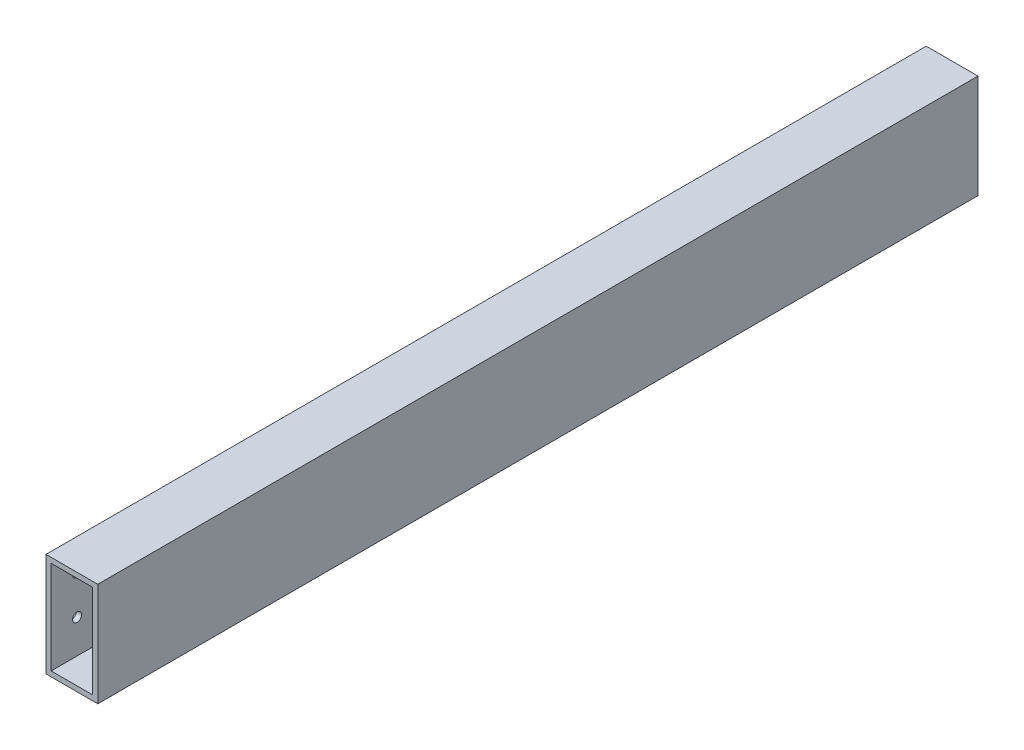
ISO-10303-21;
HEADER;
FILE_DESCRIPTION(('STEP AP214'),'2;1');
FILE_NAME('part.step','',(''),(''),'','','');
FILE_SCHEMA(('AUTOMOTIVE_DESIGN { 1 0 10303 214 1 1 1 1 }'));
ENDSEC;
DATA;
#1=APPLICATION_CONTEXT('core data for automotive mechanical design processes');
#2=APPLICATION_PROTOCOL_DEFINITION('international standard','automotive_design',2000,#1);
#3=PRODUCT_CONTEXT('',#1,'mechanical');
#4=PRODUCT('Part','Part','',(#3));
#5=PRODUCT_RELATED_PRODUCT_CATEGORY('part','',(#4));
#6=PRODUCT_DEFINITION_FORMATION('','',#4);
#7=PRODUCT_DEFINITION_CONTEXT('part definition',#1,'design');
#8=PRODUCT_DEFINITION('design','',#6,#7);
#9=PRODUCT_DEFINITION_SHAPE('','',#8);
#10=(LENGTH_UNIT() NAMED_UNIT(*) SI_UNIT(.MILLI.,.METRE.));
#11=(NAMED_UNIT(*) PLANE_ANGLE_UNIT() SI_UNIT($,.RADIAN.));
#12=(NAMED_UNIT(*) SI_UNIT($,.STERADIAN.) SOLID_ANGLE_UNIT());
#13=UNCERTAINTY_MEASURE_WITH_UNIT(LENGTH_MEASURE(1.E-05),#10,'distance_accuracy_value','');
#14=(GEOMETRIC_REPRESENTATION_CONTEXT(3) GLOBAL_UNCERTAINTY_ASSIGNED_CONTEXT((#13)) GLOBAL_UNIT_ASSIGNED_CONTEXT((#10,
#11,#12)) REPRESENTATION_CONTEXT('',''));
#15=CARTESIAN_POINT('',(0.,0.,0.));
#16=DIRECTION('',(0.,0.,1.));
#17=DIRECTION('',(1.,0.,0.));
#18=AXIS2_PLACEMENT_3D('',#15,#16,#17);
#19=CARTESIAN_POINT('',(0.,0.,340.));
#20=DIRECTION('',(0.,0.,-1.));
#21=DIRECTION('',(-1.,0.,0.));
#22=AXIS2_PLACEMENT_3D('',#19,#20,#21);
#23=PLANE('',#22);
#24=DIRECTION('',(0.,-1.,0.));
#25=VECTOR('',#24,1.);
#26=CARTESIAN_POINT('',(0.,0.,340.));
#27=LINE('',#26,#25);
#28=CARTESIAN_POINT('',(0.,40.,340.));
#29=VERTEX_POINT('',#28);
#30=CARTESIAN_POINT('',(0.,0.,340.));
#31=VERTEX_POINT('',#30);
#32=EDGE_CURVE('E136',#29,#31,#27,.T.);
#33=ORIENTED_EDGE('',*,*,#32,.T.);
#34=DIRECTION('',(1.,0.,0.));
#35=VECTOR('',#34,1.);
#36=CARTESIAN_POINT('',(0.,0.,340.));
#37=LINE('',#36,#35);
#38=CARTESIAN_POINT('',(20.,0.,340.));
#39=VERTEX_POINT('',#38);
#40=EDGE_CURVE('E139',#31,#39,#37,.T.);
#41=ORIENTED_EDGE('',*,*,#40,.T.);
#42=DIRECTION('',(0.,1.,0.));
#43=VECTOR('',#42,1.);
#44=CARTESIAN_POINT('',(20.,0.,340.));
#45=LINE('',#44,#43);
#46=CARTESIAN_POINT('',(20.,40.,340.));
#47=VERTEX_POINT('',#46);
#48=EDGE_CURVE('E142',#39,#47,#45,.T.);
#49=ORIENTED_EDGE('',*,*,#48,.T.);
#50=DIRECTION('',(-1.,0.,0.));
#51=VECTOR('',#50,1.);
#52=CARTESIAN_POINT('',(0.,40.,340.));
#53=LINE('',#52,#51);
#54=EDGE_CURVE('E144',#47,#29,#53,.T.);
#55=ORIENTED_EDGE('',*,*,#54,.T.);
#56=EDGE_LOOP('',(#33,#41,#49,#55));
#57=FACE_BOUND('',#56,.T.);
#58=DIRECTION('',(0.,-1.,0.));
#59=VECTOR('',#58,1.);
#60=CARTESIAN_POINT('',(2.,2.,340.));
#61=LINE('',#60,#59);
#62=CARTESIAN_POINT('',(2.,38.,340.));
#63=VERTEX_POINT('',#62);
#64=CARTESIAN_POINT('',(2.,2.,340.));
#65=VERTEX_POINT('',#64);
#66=EDGE_CURVE('E98',#63,#65,#61,.T.);
#67=ORIENTED_EDGE('',*,*,#66,.F.);
#68=DIRECTION('',(-1.,0.,0.));
#69=VECTOR('',#68,1.);
#70=CARTESIAN_POINT('',(2.,38.,340.));
#71=LINE('',#70,#69);
#72=CARTESIAN_POINT('',(18.,38.,340.));
#73=VERTEX_POINT('',#72);
#74=EDGE_CURVE('E120',#73,#63,#71,.T.);
#75=ORIENTED_EDGE('',*,*,#74,.F.);
#76=DIRECTION('',(0.,1.,0.));
#77=VECTOR('',#76,1.);
#78=CARTESIAN_POINT('',(18.,2.,340.));
#79=LINE('',#78,#77);
#80=CARTESIAN_POINT('',(18.,2.,340.));
#81=VERTEX_POINT('',#80);
#82=EDGE_CURVE('E118',#81,#73,#79,.T.);
#83=ORIENTED_EDGE('',*,*,#82,.F.);
#84=DIRECTION('',(1.,0.,0.));
#85=VECTOR('',#84,1.);
#86=CARTESIAN_POINT('',(2.,2.,340.));
#87=LINE('',#86,#85);
#88=EDGE_CURVE('E106',#65,#81,#87,.T.);
#89=ORIENTED_EDGE('',*,*,#88,.F.);
#90=EDGE_LOOP('',(#67,#75,#83,#89));
#91=FACE_BOUND('',#90,.T.);
#92=ADVANCED_FACE('F33',(#57,#91),#23,.F.);
#93=CARTESIAN_POINT('',(0.,0.,0.));
#94=DIRECTION('',(0.,0.,-1.));
#95=DIRECTION('',(-1.,0.,0.));
#96=AXIS2_PLACEMENT_3D('',#93,#94,#95);
#97=PLANE('',#96);
#98=DIRECTION('',(0.,-1.,0.));
#99=VECTOR('',#98,1.);
#100=CARTESIAN_POINT('',(0.,0.,0.));
#101=LINE('',#100,#99);
#102=CARTESIAN_POINT('',(0.,40.,0.));
#103=VERTEX_POINT('',#102);
#104=CARTESIAN_POINT('',(0.,0.,0.));
#105=VERTEX_POINT('',#104);
#106=EDGE_CURVE('E114',#103,#105,#101,.T.);
#107=ORIENTED_EDGE('',*,*,#106,.F.);
#108=DIRECTION('',(-1.,0.,0.));
#109=VECTOR('',#108,1.);
#110=CARTESIAN_POINT('',(0.,40.,0.));
#111=LINE('',#110,#109);
#112=CARTESIAN_POINT('',(20.,40.,0.));
#113=VERTEX_POINT('',#112);
#114=EDGE_CURVE('E140',#113,#103,#111,.T.);
#115=ORIENTED_EDGE('',*,*,#114,.F.);
#116=DIRECTION('',(0.,1.,0.));
#117=VECTOR('',#116,1.);
#118=CARTESIAN_POINT('',(20.,0.,0.));
#119=LINE('',#118,#117);
#120=CARTESIAN_POINT('',(20.,0.,0.));
#121=VERTEX_POINT('',#120);
#122=EDGE_CURVE('E151',#121,#113,#119,.T.);
#123=ORIENTED_EDGE('',*,*,#122,.F.);
#124=DIRECTION('',(1.,0.,0.));
#125=VECTOR('',#124,1.);
#126=CARTESIAN_POINT('',(0.,0.,0.));
#127=LINE('',#126,#125);
#128=EDGE_CURVE('E149',#105,#121,#127,.T.);
#129=ORIENTED_EDGE('',*,*,#128,.F.);
#130=EDGE_LOOP('',(#107,#115,#123,#129));
#131=FACE_BOUND('',#130,.T.);
#132=DIRECTION('',(-1.,0.,0.));
#133=VECTOR('',#132,1.);
#134=CARTESIAN_POINT('',(2.,38.,0.));
#135=LINE('',#134,#133);
#136=CARTESIAN_POINT('',(18.,38.,0.));
#137=VERTEX_POINT('',#136);
#138=CARTESIAN_POINT('',(2.,38.,0.));
#139=VERTEX_POINT('',#138);
#140=EDGE_CURVE('E107',#137,#139,#135,.T.);
#141=ORIENTED_EDGE('',*,*,#140,.T.);
#142=DIRECTION('',(0.,-1.,0.));
#143=VECTOR('',#142,1.);
#144=CARTESIAN_POINT('',(2.,2.,0.));
#145=LINE('',#144,#143);
#146=CARTESIAN_POINT('',(2.,2.,0.));
#147=VERTEX_POINT('',#146);
#148=EDGE_CURVE('E56',#139,#147,#145,.T.);
#149=ORIENTED_EDGE('',*,*,#148,.T.);
#150=DIRECTION('',(1.,0.,0.));
#151=VECTOR('',#150,1.);
#152=CARTESIAN_POINT('',(2.,2.,0.));
#153=LINE('',#152,#151);
#154=CARTESIAN_POINT('',(18.,2.,0.));
#155=VERTEX_POINT('',#154);
#156=EDGE_CURVE('E113',#147,#155,#153,.T.);
#157=ORIENTED_EDGE('',*,*,#156,.T.);
#158=DIRECTION('',(0.,1.,0.));
#159=VECTOR('',#158,1.);
#160=CARTESIAN_POINT('',(18.,2.,0.));
#161=LINE('',#160,#159);
#162=EDGE_CURVE('E128',#155,#137,#161,.T.);
#163=ORIENTED_EDGE('',*,*,#162,.T.);
#164=EDGE_LOOP('',(#141,#149,#157,#163));
#165=FACE_BOUND('',#164,.T.);
#166=ADVANCED_FACE('F169',(#131,#165),#97,.T.);
#167=CARTESIAN_POINT('',(0.,0.,340.));
#168=DIRECTION('',(1.,0.,0.));
#169=DIRECTION('',(0.,0.,-1.));
#170=AXIS2_PLACEMENT_3D('',#167,#168,#169);
#171=PLANE('',#170);
#172=CARTESIAN_POINT('',(0.,30.,330.));
#173=DIRECTION('',(-1.,0.,0.));
#174=DIRECTION('',(0.,0.,-1.));
#175=AXIS2_PLACEMENT_3D('',#172,#173,#174);
#176=CIRCLE('',#175,1.74999999999998);
#177=CARTESIAN_POINT('',(0.,30.,328.25));
#178=VERTEX_POINT('',#177);
#179=EDGE_CURVE('E240',#178,#178,#176,.T.);
#180=ORIENTED_EDGE('',*,*,#179,.F.);
#181=EDGE_LOOP('',(#180));
#182=FACE_BOUND('',#181,.T.);
#183=CARTESIAN_POINT('',(0.,15.,330.));
#184=DIRECTION('',(-1.,0.,0.));
#185=DIRECTION('',(0.,0.,-1.));
#186=AXIS2_PLACEMENT_3D('',#183,#184,#185);
#187=CIRCLE('',#186,1.74999999999998);
#188=CARTESIAN_POINT('',(0.,15.,328.25));
#189=VERTEX_POINT('',#188);
#190=EDGE_CURVE('E244',#189,#189,#187,.T.);
#191=ORIENTED_EDGE('',*,*,#190,.F.);
#192=EDGE_LOOP('',(#191));
#193=FACE_BOUND('',#192,.T.);
#194=CARTESIAN_POINT('',(0.,15.,285.));
#195=DIRECTION('',(-1.,0.,0.));
#196=DIRECTION('',(0.,0.,-1.));
#197=AXIS2_PLACEMENT_3D('',#194,#195,#196);
#198=CIRCLE('',#197,1.74999999999998);
#199=CARTESIAN_POINT('',(0.,15.,283.25));
#200=VERTEX_POINT('',#199);
#201=EDGE_CURVE('E248',#200,#200,#198,.T.);
#202=ORIENTED_EDGE('',*,*,#201,.F.);
#203=EDGE_LOOP('',(#202));
#204=FACE_BOUND('',#203,.T.);
#205=CARTESIAN_POINT('',(0.,15.,10.));
#206=DIRECTION('',(-1.,0.,0.));
#207=DIRECTION('',(0.,0.,1.));
#208=AXIS2_PLACEMENT_3D('',#205,#206,#207);
#209=CIRCLE('',#208,1.75);
#210=CARTESIAN_POINT('',(0.,15.,11.75));
#211=VERTEX_POINT('',#210);
#212=EDGE_CURVE('E257',#211,#211,#209,.T.);
#213=ORIENTED_EDGE('',*,*,#212,.F.);
#214=EDGE_LOOP('',(#213));
#215=FACE_BOUND('',#214,.T.);
#216=CARTESIAN_POINT('',(0.,15.,70.));
#217=DIRECTION('',(-1.,0.,0.));
#218=DIRECTION('',(0.,0.,1.));
#219=AXIS2_PLACEMENT_3D('',#216,#217,#218);
#220=CIRCLE('',#219,1.75);
#221=CARTESIAN_POINT('',(0.,15.,71.75));
#222=VERTEX_POINT('',#221);
#223=EDGE_CURVE('E253',#222,#222,#220,.T.);
#224=ORIENTED_EDGE('',*,*,#223,.F.);
#225=EDGE_LOOP('',(#224));
#226=FACE_BOUND('',#225,.T.);
#227=CARTESIAN_POINT('',(0.,15.,55.));
#228=DIRECTION('',(-1.,0.,0.));
#229=DIRECTION('',(0.,0.,1.));
#230=AXIS2_PLACEMENT_3D('',#227,#228,#229);
#231=CIRCLE('',#230,1.75);
#232=CARTESIAN_POINT('',(0.,15.,56.75));
#233=VERTEX_POINT('',#232);
#234=EDGE_CURVE('E264',#233,#233,#231,.T.);
#235=ORIENTED_EDGE('',*,*,#234,.F.);
#236=EDGE_LOOP('',(#235));
#237=FACE_BOUND('',#236,.T.);
#238=CARTESIAN_POINT('',(0.,15.,270.));
#239=DIRECTION('',(-1.,0.,0.));
#240=DIRECTION('',(0.,0.,-1.));
#241=AXIS2_PLACEMENT_3D('',#238,#239,#240);
#242=CIRCLE('',#241,1.74999999999998);
#243=CARTESIAN_POINT('',(0.,15.,268.25));
#244=VERTEX_POINT('',#243);
#245=EDGE_CURVE('E252',#244,#244,#242,.T.);
#246=ORIENTED_EDGE('',*,*,#245,.F.);
#247=EDGE_LOOP('',(#246));
#248=FACE_BOUND('',#247,.T.);
#249=CARTESIAN_POINT('',(0.,30.,10.));
#250=DIRECTION('',(-1.,0.,0.));
#251=DIRECTION('',(0.,0.,1.));
#252=AXIS2_PLACEMENT_3D('',#249,#250,#251);
#253=CIRCLE('',#252,1.75);
#254=CARTESIAN_POINT('',(0.,30.,11.75));
#255=VERTEX_POINT('',#254);
#256=EDGE_CURVE('E236',#255,#255,#253,.T.);
#257=ORIENTED_EDGE('',*,*,#256,.F.);
#258=EDGE_LOOP('',(#257));
#259=FACE_BOUND('',#258,.T.);
#260=ORIENTED_EDGE('',*,*,#106,.T.);
#261=DIRECTION('',(0.,0.,-1.));
#262=VECTOR('',#261,1.);
#263=CARTESIAN_POINT('',(0.,0.,340.));
#264=LINE('',#263,#262);
#265=EDGE_CURVE('E11',#31,#105,#264,.T.);
#266=ORIENTED_EDGE('',*,*,#265,.F.);
#267=ORIENTED_EDGE('',*,*,#32,.F.);
#268=DIRECTION('',(0.,0.,-1.));
#269=VECTOR('',#268,1.);
#270=CARTESIAN_POINT('',(0.,40.,340.));
#271=LINE('',#270,#269);
#272=EDGE_CURVE('E146',#29,#103,#271,.T.);
#273=ORIENTED_EDGE('',*,*,#272,.T.);
#274=EDGE_LOOP('',(#260,#266,#267,#273));
#275=FACE_BOUND('',#274,.T.);
#276=ADVANCED_FACE('F35',(#182,#193,#204,#215,#226,#237,#248,#259,#275),#171,.F.);
#277=CARTESIAN_POINT('',(0.,0.,340.));
#278=DIRECTION('',(0.,1.,0.));
#279=DIRECTION('',(0.,0.,1.));
#280=AXIS2_PLACEMENT_3D('',#277,#278,#279);
#281=PLANE('',#280);
#282=ORIENTED_EDGE('',*,*,#128,.T.);
#283=DIRECTION('',(0.,0.,-1.));
#284=VECTOR('',#283,1.);
#285=CARTESIAN_POINT('',(20.,0.,340.));
#286=LINE('',#285,#284);
#287=EDGE_CURVE('E41',#39,#121,#286,.T.);
#288=ORIENTED_EDGE('',*,*,#287,.F.);
#289=ORIENTED_EDGE('',*,*,#40,.F.);
#290=ORIENTED_EDGE('',*,*,#265,.T.);
#291=EDGE_LOOP('',(#282,#288,#289,#290));
#292=FACE_BOUND('',#291,.T.);
#293=ADVANCED_FACE('F179',(#292),#281,.F.);
#294=CARTESIAN_POINT('',(20.,0.,340.));
#295=DIRECTION('',(-1.,0.,0.));
#296=DIRECTION('',(0.,0.,1.));
#297=AXIS2_PLACEMENT_3D('',#294,#295,#296);
#298=PLANE('',#297);
#299=ORIENTED_EDGE('',*,*,#122,.T.);
#300=DIRECTION('',(0.,0.,-1.));
#301=VECTOR('',#300,1.);
#302=CARTESIAN_POINT('',(20.,40.,340.));
#303=LINE('',#302,#301);
#304=EDGE_CURVE('E156',#47,#113,#303,.T.);
#305=ORIENTED_EDGE('',*,*,#304,.F.);
#306=ORIENTED_EDGE('',*,*,#48,.F.);
#307=ORIENTED_EDGE('',*,*,#287,.T.);
#308=EDGE_LOOP('',(#299,#305,#306,#307));
#309=FACE_BOUND('',#308,.T.);
#310=ADVANCED_FACE('F163',(#309),#298,.F.);
#311=CARTESIAN_POINT('',(0.,40.,340.));
#312=DIRECTION('',(0.,-1.,0.));
#313=DIRECTION('',(0.,0.,-1.));
#314=AXIS2_PLACEMENT_3D('',#311,#312,#313);
#315=PLANE('',#314);
#316=ORIENTED_EDGE('',*,*,#114,.T.);
#317=ORIENTED_EDGE('',*,*,#272,.F.);
#318=ORIENTED_EDGE('',*,*,#54,.F.);
#319=ORIENTED_EDGE('',*,*,#304,.T.);
#320=EDGE_LOOP('',(#316,#317,#318,#319));
#321=FACE_BOUND('',#320,.T.);
#322=ADVANCED_FACE('F173',(#321),#315,.F.);
#323=CARTESIAN_POINT('',(2.,2.,340.));
#324=DIRECTION('',(1.,0.,0.));
#325=DIRECTION('',(0.,0.,-1.));
#326=AXIS2_PLACEMENT_3D('',#323,#324,#325);
#327=PLANE('',#326);
#328=CARTESIAN_POINT('',(2.,30.,330.));
#329=DIRECTION('',(-1.,0.,0.));
#330=DIRECTION('',(0.,0.,-1.));
#331=AXIS2_PLACEMENT_3D('',#328,#329,#330);
#332=CIRCLE('',#331,1.74999999999998);
#333=CARTESIAN_POINT('',(2.,30.,328.25));
#334=VERTEX_POINT('',#333);
#335=EDGE_CURVE('E208',#334,#334,#332,.T.);
#336=ORIENTED_EDGE('',*,*,#335,.T.);
#337=EDGE_LOOP('',(#336));
#338=FACE_BOUND('',#337,.T.);
#339=CARTESIAN_POINT('',(2.,15.,330.));
#340=DIRECTION('',(-1.,0.,0.));
#341=DIRECTION('',(0.,0.,-1.));
#342=AXIS2_PLACEMENT_3D('',#339,#340,#341);
#343=CIRCLE('',#342,1.74999999999998);
#344=CARTESIAN_POINT('',(2.,15.,328.25));
#345=VERTEX_POINT('',#344);
#346=EDGE_CURVE('E212',#345,#345,#343,.T.);
#347=ORIENTED_EDGE('',*,*,#346,.T.);
#348=EDGE_LOOP('',(#347));
#349=FACE_BOUND('',#348,.T.);
#350=CARTESIAN_POINT('',(2.,15.,285.));
#351=DIRECTION('',(-1.,0.,0.));
#352=DIRECTION('',(0.,0.,-1.));
#353=AXIS2_PLACEMENT_3D('',#350,#351,#352);
#354=CIRCLE('',#353,1.74999999999998);
#355=CARTESIAN_POINT('',(2.,15.,283.25));
#356=VERTEX_POINT('',#355);
#357=EDGE_CURVE('E216',#356,#356,#354,.T.);
#358=ORIENTED_EDGE('',*,*,#357,.T.);
#359=EDGE_LOOP('',(#358));
#360=FACE_BOUND('',#359,.T.);
#361=CARTESIAN_POINT('',(2.,15.,10.));
#362=DIRECTION('',(-1.,0.,0.));
#363=DIRECTION('',(0.,0.,1.));
#364=AXIS2_PLACEMENT_3D('',#361,#362,#363);
#365=CIRCLE('',#364,1.75);
#366=CARTESIAN_POINT('',(2.,15.,11.75));
#367=VERTEX_POINT('',#366);
#368=EDGE_CURVE('E220',#367,#367,#365,.T.);
#369=ORIENTED_EDGE('',*,*,#368,.T.);
#370=EDGE_LOOP('',(#369));
#371=FACE_BOUND('',#370,.T.);
#372=CARTESIAN_POINT('',(2.,15.,70.));
#373=DIRECTION('',(-1.,0.,0.));
#374=DIRECTION('',(0.,0.,1.));
#375=AXIS2_PLACEMENT_3D('',#372,#373,#374);
#376=CIRCLE('',#375,1.75);
#377=CARTESIAN_POINT('',(2.,15.,71.75));
#378=VERTEX_POINT('',#377);
#379=EDGE_CURVE('E224',#378,#378,#376,.T.);
#380=ORIENTED_EDGE('',*,*,#379,.T.);
#381=EDGE_LOOP('',(#380));
#382=FACE_BOUND('',#381,.T.);
#383=CARTESIAN_POINT('',(2.,15.,55.));
#384=DIRECTION('',(-1.,0.,0.));
#385=DIRECTION('',(0.,0.,1.));
#386=AXIS2_PLACEMENT_3D('',#383,#384,#385);
#387=CIRCLE('',#386,1.75);
#388=CARTESIAN_POINT('',(2.,15.,56.75));
#389=VERTEX_POINT('',#388);
#390=EDGE_CURVE('E228',#389,#389,#387,.T.);
#391=ORIENTED_EDGE('',*,*,#390,.T.);
#392=EDGE_LOOP('',(#391));
#393=FACE_BOUND('',#392,.T.);
#394=CARTESIAN_POINT('',(2.,15.,270.));
#395=DIRECTION('',(-1.,0.,0.));
#396=DIRECTION('',(0.,0.,-1.));
#397=AXIS2_PLACEMENT_3D('',#394,#395,#396);
#398=CIRCLE('',#397,1.74999999999998);
#399=CARTESIAN_POINT('',(2.,15.,268.25));
#400=VERTEX_POINT('',#399);
#401=EDGE_CURVE('E232',#400,#400,#398,.T.);
#402=ORIENTED_EDGE('',*,*,#401,.T.);
#403=EDGE_LOOP('',(#402));
#404=FACE_BOUND('',#403,.T.);
#405=CARTESIAN_POINT('',(2.,30.,10.));
#406=DIRECTION('',(-1.,0.,0.));
#407=DIRECTION('',(0.,0.,1.));
#408=AXIS2_PLACEMENT_3D('',#405,#406,#407);
#409=CIRCLE('',#408,1.75);
#410=CARTESIAN_POINT('',(2.,30.,11.75));
#411=VERTEX_POINT('',#410);
#412=EDGE_CURVE('E126',#411,#411,#409,.T.);
#413=ORIENTED_EDGE('',*,*,#412,.T.);
#414=EDGE_LOOP('',(#413));
#415=FACE_BOUND('',#414,.T.);
#416=ORIENTED_EDGE('',*,*,#148,.F.);
#417=DIRECTION('',(0.,0.,-1.));
#418=VECTOR('',#417,1.);
#419=CARTESIAN_POINT('',(2.,38.,340.));
#420=LINE('',#419,#418);
#421=EDGE_CURVE('E102',#63,#139,#420,.T.);
#422=ORIENTED_EDGE('',*,*,#421,.F.);
#423=ORIENTED_EDGE('',*,*,#66,.T.);
#424=DIRECTION('',(0.,0.,-1.));
#425=VECTOR('',#424,1.);
#426=CARTESIAN_POINT('',(2.,2.,340.));
#427=LINE('',#426,#425);
#428=EDGE_CURVE('E101',#65,#147,#427,.T.);
#429=ORIENTED_EDGE('',*,*,#428,.T.);
#430=EDGE_LOOP('',(#416,#422,#423,#429));
#431=FACE_BOUND('',#430,.T.);
#432=ADVANCED_FACE('F100',(#338,#349,#360,#371,#382,#393,#404,#415,#431),#327,.T.);
#433=CARTESIAN_POINT('',(2.,2.,340.));
#434=DIRECTION('',(0.,1.,0.));
#435=DIRECTION('',(0.,0.,1.));
#436=AXIS2_PLACEMENT_3D('',#433,#434,#435);
#437=PLANE('',#436);
#438=ORIENTED_EDGE('',*,*,#156,.F.);
#439=ORIENTED_EDGE('',*,*,#428,.F.);
#440=ORIENTED_EDGE('',*,*,#88,.T.);
#441=DIRECTION('',(0.,0.,-1.));
#442=VECTOR('',#441,1.);
#443=CARTESIAN_POINT('',(18.,2.,340.));
#444=LINE('',#443,#442);
#445=EDGE_CURVE('E115',#81,#155,#444,.T.);
#446=ORIENTED_EDGE('',*,*,#445,.T.);
#447=EDGE_LOOP('',(#438,#439,#440,#446));
#448=FACE_BOUND('',#447,.T.);
#449=ADVANCED_FACE('F110',(#448),#437,.T.);
#450=CARTESIAN_POINT('',(18.,2.,340.));
#451=DIRECTION('',(-1.,0.,0.));
#452=DIRECTION('',(0.,0.,1.));
#453=AXIS2_PLACEMENT_3D('',#450,#451,#452);
#454=PLANE('',#453);
#455=ORIENTED_EDGE('',*,*,#162,.F.);
#456=ORIENTED_EDGE('',*,*,#445,.F.);
#457=ORIENTED_EDGE('',*,*,#82,.T.);
#458=DIRECTION('',(0.,0.,-1.));
#459=VECTOR('',#458,1.);
#460=CARTESIAN_POINT('',(18.,38.,340.));
#461=LINE('',#460,#459);
#462=EDGE_CURVE('E48',#73,#137,#461,.T.);
#463=ORIENTED_EDGE('',*,*,#462,.T.);
#464=EDGE_LOOP('',(#455,#456,#457,#463));
#465=FACE_BOUND('',#464,.T.);
#466=ADVANCED_FACE('F204',(#465),#454,.T.);
#467=CARTESIAN_POINT('',(2.,38.,340.));
#468=DIRECTION('',(0.,-1.,0.));
#469=DIRECTION('',(0.,0.,-1.));
#470=AXIS2_PLACEMENT_3D('',#467,#468,#469);
#471=PLANE('',#470);
#472=ORIENTED_EDGE('',*,*,#140,.F.);
#473=ORIENTED_EDGE('',*,*,#462,.F.);
#474=ORIENTED_EDGE('',*,*,#74,.T.);
#475=ORIENTED_EDGE('',*,*,#421,.T.);
#476=EDGE_LOOP('',(#472,#473,#474,#475));
#477=FACE_BOUND('',#476,.T.);
#478=ADVANCED_FACE('F279',(#477),#471,.T.);
#479=CARTESIAN_POINT('',(2.,30.,10.));
#480=DIRECTION('',(-1.,0.,0.));
#481=DIRECTION('',(0.,0.,1.));
#482=AXIS2_PLACEMENT_3D('',#479,#480,#481);
#483=CYLINDRICAL_SURFACE('',#482,1.75);
#484=ORIENTED_EDGE('',*,*,#412,.F.);
#485=EDGE_LOOP('',(#484));
#486=FACE_BOUND('',#485,.T.);
#487=ORIENTED_EDGE('',*,*,#256,.T.);
#488=EDGE_LOOP('',(#487));
#489=FACE_BOUND('',#488,.T.);
#490=ADVANCED_FACE('F276',(#486,#489),#483,.F.);
#491=CARTESIAN_POINT('',(2.,15.,270.));
#492=DIRECTION('',(-1.,0.,0.));
#493=DIRECTION('',(0.,0.,1.));
#494=AXIS2_PLACEMENT_3D('',#491,#492,#493);
#495=CYLINDRICAL_SURFACE('',#494,1.74999999999998);
#496=ORIENTED_EDGE('',*,*,#401,.F.);
#497=EDGE_LOOP('',(#496));
#498=FACE_BOUND('',#497,.T.);
#499=ORIENTED_EDGE('',*,*,#245,.T.);
#500=EDGE_LOOP('',(#499));
#501=FACE_BOUND('',#500,.T.);
#502=ADVANCED_FACE('F278',(#498,#501),#495,.F.);
#503=CARTESIAN_POINT('',(2.,15.,55.));
#504=DIRECTION('',(-1.,0.,0.));
#505=DIRECTION('',(0.,0.,1.));
#506=AXIS2_PLACEMENT_3D('',#503,#504,#505);
#507=CYLINDRICAL_SURFACE('',#506,1.75);
#508=ORIENTED_EDGE('',*,*,#390,.F.);
#509=EDGE_LOOP('',(#508));
#510=FACE_BOUND('',#509,.T.);
#511=ORIENTED_EDGE('',*,*,#234,.T.);
#512=EDGE_LOOP('',(#511));
#513=FACE_BOUND('',#512,.T.);
#514=ADVANCED_FACE('F269',(#510,#513),#507,.F.);
#515=CARTESIAN_POINT('',(2.,15.,70.));
#516=DIRECTION('',(-1.,0.,0.));
#517=DIRECTION('',(0.,0.,1.));
#518=AXIS2_PLACEMENT_3D('',#515,#516,#517);
#519=CYLINDRICAL_SURFACE('',#518,1.75);
#520=ORIENTED_EDGE('',*,*,#379,.F.);
#521=EDGE_LOOP('',(#520));
#522=FACE_BOUND('',#521,.T.);
#523=ORIENTED_EDGE('',*,*,#223,.T.);
#524=EDGE_LOOP('',(#523));
#525=FACE_BOUND('',#524,.T.);
#526=ADVANCED_FACE('F336',(#522,#525),#519,.F.);
#527=CARTESIAN_POINT('',(2.,15.,10.));
#528=DIRECTION('',(-1.,0.,0.));
#529=DIRECTION('',(0.,0.,1.));
#530=AXIS2_PLACEMENT_3D('',#527,#528,#529);
#531=CYLINDRICAL_SURFACE('',#530,1.75);
#532=ORIENTED_EDGE('',*,*,#368,.F.);
#533=EDGE_LOOP('',(#532));
#534=FACE_BOUND('',#533,.T.);
#535=ORIENTED_EDGE('',*,*,#212,.T.);
#536=EDGE_LOOP('',(#535));
#537=FACE_BOUND('',#536,.T.);
#538=ADVANCED_FACE('F346',(#534,#537),#531,.F.);
#539=CARTESIAN_POINT('',(2.,15.,285.));
#540=DIRECTION('',(-1.,0.,0.));
#541=DIRECTION('',(0.,0.,1.));
#542=AXIS2_PLACEMENT_3D('',#539,#540,#541);
#543=CYLINDRICAL_SURFACE('',#542,1.74999999999998);
#544=ORIENTED_EDGE('',*,*,#357,.F.);
#545=EDGE_LOOP('',(#544));
#546=FACE_BOUND('',#545,.T.);
#547=ORIENTED_EDGE('',*,*,#201,.T.);
#548=EDGE_LOOP('',(#547));
#549=FACE_BOUND('',#548,.T.);
#550=ADVANCED_FACE('F356',(#546,#549),#543,.F.);
#551=CARTESIAN_POINT('',(2.,15.,330.));
#552=DIRECTION('',(-1.,0.,0.));
#553=DIRECTION('',(0.,0.,1.));
#554=AXIS2_PLACEMENT_3D('',#551,#552,#553);
#555=CYLINDRICAL_SURFACE('',#554,1.74999999999998);
#556=ORIENTED_EDGE('',*,*,#346,.F.);
#557=EDGE_LOOP('',(#556));
#558=FACE_BOUND('',#557,.T.);
#559=ORIENTED_EDGE('',*,*,#190,.T.);
#560=EDGE_LOOP('',(#559));
#561=FACE_BOUND('',#560,.T.);
#562=ADVANCED_FACE('F366',(#558,#561),#555,.F.);
#563=CARTESIAN_POINT('',(2.,30.,330.));
#564=DIRECTION('',(-1.,0.,0.));
#565=DIRECTION('',(0.,0.,1.));
#566=AXIS2_PLACEMENT_3D('',#563,#564,#565);
#567=CYLINDRICAL_SURFACE('',#566,1.74999999999998);
#568=ORIENTED_EDGE('',*,*,#335,.F.);
#569=EDGE_LOOP('',(#568));
#570=FACE_BOUND('',#569,.T.);
#571=ORIENTED_EDGE('',*,*,#179,.T.);
#572=EDGE_LOOP('',(#571));
#573=FACE_BOUND('',#572,.T.);
#574=ADVANCED_FACE('F289',(#570,#573),#567,.F.);
#575=CLOSED_SHELL('',(#92,#166,#276,#293,#310,#322,#432,#449,#466,#478,#490,#502,#514,#526,#538,
#550,#562,#574));
#576=MANIFOLD_SOLID_BREP('B2',#575);
#577=ADVANCED_BREP_SHAPE_REPRESENTATION('',(#18,#576),#14);
#578=SHAPE_DEFINITION_REPRESENTATION(#9,#577);
ENDSEC;
END-ISO-10303-21;
